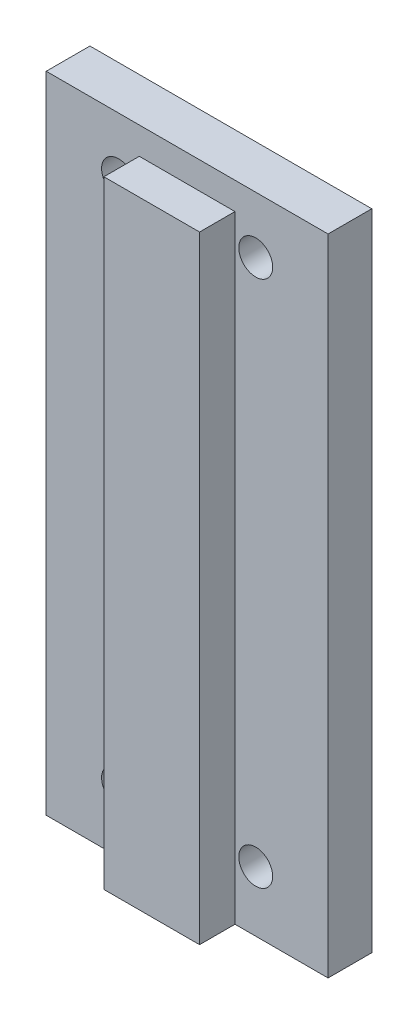
ISO-10303-21;
HEADER;
FILE_DESCRIPTION(('STEP AP214'),'2;1');
FILE_NAME('part.step','',(''),(''),'','','');
FILE_SCHEMA(('AUTOMOTIVE_DESIGN { 1 0 10303 214 1 1 1 1 }'));
ENDSEC;
DATA;
#1=APPLICATION_CONTEXT('core data for automotive mechanical design processes');
#2=APPLICATION_PROTOCOL_DEFINITION('international standard','automotive_design',2000,#1);
#3=PRODUCT_CONTEXT('',#1,'mechanical');
#4=PRODUCT('Part','Part','',(#3));
#5=PRODUCT_RELATED_PRODUCT_CATEGORY('part','',(#4));
#6=PRODUCT_DEFINITION_FORMATION('','',#4);
#7=PRODUCT_DEFINITION_CONTEXT('part definition',#1,'design');
#8=PRODUCT_DEFINITION('design','',#6,#7);
#9=PRODUCT_DEFINITION_SHAPE('','',#8);
#10=(LENGTH_UNIT() NAMED_UNIT(*) SI_UNIT(.MILLI.,.METRE.));
#11=(NAMED_UNIT(*) PLANE_ANGLE_UNIT() SI_UNIT($,.RADIAN.));
#12=(NAMED_UNIT(*) SI_UNIT($,.STERADIAN.) SOLID_ANGLE_UNIT());
#13=UNCERTAINTY_MEASURE_WITH_UNIT(LENGTH_MEASURE(1.E-05),#10,'distance_accuracy_value','');
#14=(GEOMETRIC_REPRESENTATION_CONTEXT(3) GLOBAL_UNCERTAINTY_ASSIGNED_CONTEXT((#13)) GLOBAL_UNIT_ASSIGNED_CONTEXT((#10,
#11,#12)) REPRESENTATION_CONTEXT('',''));
#15=CARTESIAN_POINT('',(0.,0.,0.));
#16=DIRECTION('',(0.,0.,1.));
#17=DIRECTION('',(1.,0.,0.));
#18=AXIS2_PLACEMENT_3D('',#15,#16,#17);
#19=CARTESIAN_POINT('',(0.,0.,5.79999999999997));
#20=DIRECTION('',(0.,0.,-1.));
#21=DIRECTION('',(-1.,0.,0.));
#22=AXIS2_PLACEMENT_3D('',#19,#20,#21);
#23=PLANE('',#22);
#24=CARTESIAN_POINT('',(27.8,7.99999999999998,5.79999999999997));
#25=DIRECTION('',(0.,0.,-1.));
#26=DIRECTION('',(-1.,0.,0.));
#27=AXIS2_PLACEMENT_3D('',#24,#25,#26);
#28=CIRCLE('',#27,2.25);
#29=CARTESIAN_POINT('',(25.55,8.00000000000001,5.79999999999997));
#30=VERTEX_POINT('',#29);
#31=EDGE_CURVE('E330',#30,#30,#28,.F.);
#32=ORIENTED_EDGE('',*,*,#31,.F.);
#33=EDGE_LOOP('',(#32));
#34=FACE_BOUND('',#33,.T.);
#35=CARTESIAN_POINT('',(9.6,8.00000000000001,5.79999999999997));
#36=DIRECTION('',(0.,0.,-1.));
#37=DIRECTION('',(-1.,0.,0.));
#38=AXIS2_PLACEMENT_3D('',#35,#36,#37);
#39=CIRCLE('',#38,2.25);
#40=CARTESIAN_POINT('',(7.35000000000001,8.00000000000001,5.79999999999997));
#41=VERTEX_POINT('',#40);
#42=EDGE_CURVE('E341',#41,#41,#39,.F.);
#43=ORIENTED_EDGE('',*,*,#42,.F.);
#44=EDGE_LOOP('',(#43));
#45=FACE_BOUND('',#44,.T.);
#46=CARTESIAN_POINT('',(9.59999999999998,78.,5.80000000000003));
#47=DIRECTION('',(0.,0.,-1.));
#48=DIRECTION('',(-1.,0.,0.));
#49=AXIS2_PLACEMENT_3D('',#46,#47,#48);
#50=CIRCLE('',#49,2.25);
#51=CARTESIAN_POINT('',(7.35,78.,5.80000000000003));
#52=VERTEX_POINT('',#51);
#53=EDGE_CURVE('E348',#52,#52,#50,.F.);
#54=ORIENTED_EDGE('',*,*,#53,.F.);
#55=EDGE_LOOP('',(#54));
#56=FACE_BOUND('',#55,.T.);
#57=CARTESIAN_POINT('',(27.8,78.,5.80000000000003));
#58=DIRECTION('',(0.,0.,-1.));
#59=DIRECTION('',(-1.,0.,0.));
#60=AXIS2_PLACEMENT_3D('',#57,#58,#59);
#61=CIRCLE('',#60,2.25);
#62=CARTESIAN_POINT('',(25.55,78.,5.80000000000003));
#63=VERTEX_POINT('',#62);
#64=EDGE_CURVE('E214',#63,#63,#61,.F.);
#65=ORIENTED_EDGE('',*,*,#64,.F.);
#66=EDGE_LOOP('',(#65));
#67=FACE_BOUND('',#66,.T.);
#68=DIRECTION('',(0.,-1.,0.));
#69=VECTOR('',#68,1.);
#70=CARTESIAN_POINT('',(12.35,0.,5.79999999999997));
#71=LINE('',#70,#69);
#72=CARTESIAN_POINT('',(12.35,81.9,5.8));
#73=VERTEX_POINT('',#72);
#74=CARTESIAN_POINT('',(12.35,0.,5.79999999999997));
#75=VERTEX_POINT('',#74);
#76=EDGE_CURVE('E54',#73,#75,#71,.T.);
#77=ORIENTED_EDGE('',*,*,#76,.F.);
#78=DIRECTION('',(-1.,0.,0.));
#79=VECTOR('',#78,1.);
#80=CARTESIAN_POINT('',(12.35,81.9,5.8));
#81=LINE('',#80,#79);
#82=CARTESIAN_POINT('',(25.05,81.9,5.8));
#83=VERTEX_POINT('',#82);
#84=EDGE_CURVE('E124',#83,#73,#81,.T.);
#85=ORIENTED_EDGE('',*,*,#84,.F.);
#86=DIRECTION('',(0.,1.,0.));
#87=VECTOR('',#86,1.);
#88=CARTESIAN_POINT('',(25.05,0.,5.79999999999997));
#89=LINE('',#88,#87);
#90=CARTESIAN_POINT('',(25.05,0.,5.79999999999997));
#91=VERTEX_POINT('',#90);
#92=EDGE_CURVE('E60',#91,#83,#89,.T.);
#93=ORIENTED_EDGE('',*,*,#92,.F.);
#94=DIRECTION('',(1.,0.,0.));
#95=VECTOR('',#94,1.);
#96=CARTESIAN_POINT('',(0.,0.,5.79999999999997));
#97=LINE('',#96,#95);
#98=CARTESIAN_POINT('',(37.4,0.,5.80000000000003));
#99=VERTEX_POINT('',#98);
#100=EDGE_CURVE('E144',#91,#99,#97,.T.);
#101=ORIENTED_EDGE('',*,*,#100,.T.);
#102=DIRECTION('',(0.,1.,0.));
#103=VECTOR('',#102,1.);
#104=CARTESIAN_POINT('',(37.4,0.,5.80000000000003));
#105=LINE('',#104,#103);
#106=CARTESIAN_POINT('',(37.4,85.5,5.8));
#107=VERTEX_POINT('',#106);
#108=EDGE_CURVE('E149',#99,#107,#105,.T.);
#109=ORIENTED_EDGE('',*,*,#108,.T.);
#110=DIRECTION('',(-1.,0.,0.));
#111=VECTOR('',#110,1.);
#112=CARTESIAN_POINT('',(0.,85.5,5.8));
#113=LINE('',#112,#111);
#114=CARTESIAN_POINT('',(0.,85.5,5.8));
#115=VERTEX_POINT('',#114);
#116=EDGE_CURVE('E152',#107,#115,#113,.T.);
#117=ORIENTED_EDGE('',*,*,#116,.T.);
#118=DIRECTION('',(0.,-1.,0.));
#119=VECTOR('',#118,1.);
#120=CARTESIAN_POINT('',(0.,0.,5.79999999999997));
#121=LINE('',#120,#119);
#122=CARTESIAN_POINT('',(0.,0.,5.79999999999997));
#123=VERTEX_POINT('',#122);
#124=EDGE_CURVE('E140',#115,#123,#121,.T.);
#125=ORIENTED_EDGE('',*,*,#124,.T.);
#126=EDGE_CURVE('E146',#123,#75,#97,.T.);
#127=ORIENTED_EDGE('',*,*,#126,.T.);
#128=EDGE_LOOP('',(#77,#85,#93,#101,#109,#117,#125,#127));
#129=FACE_BOUND('',#128,.T.);
#130=ADVANCED_FACE('F38',(#34,#45,#56,#67,#129),#23,.F.);
#131=CARTESIAN_POINT('',(0.,0.,5.79999999999997));
#132=DIRECTION('',(1.,0.,0.));
#133=DIRECTION('',(0.,0.,-1.));
#134=AXIS2_PLACEMENT_3D('',#131,#132,#133);
#135=PLANE('',#134);
#136=DIRECTION('',(0.,-1.,0.));
#137=VECTOR('',#136,1.);
#138=CARTESIAN_POINT('',(0.,0.,0.));
#139=LINE('',#138,#137);
#140=CARTESIAN_POINT('',(0.,85.5,0.));
#141=VERTEX_POINT('',#140);
#142=CARTESIAN_POINT('',(0.,0.,0.));
#143=VERTEX_POINT('',#142);
#144=EDGE_CURVE('E128',#141,#143,#139,.T.);
#145=ORIENTED_EDGE('',*,*,#144,.T.);
#146=DIRECTION('',(0.,0.,-1.));
#147=VECTOR('',#146,1.);
#148=CARTESIAN_POINT('',(0.,0.,5.79999999999997));
#149=LINE('',#148,#147);
#150=EDGE_CURVE('E11',#123,#143,#149,.T.);
#151=ORIENTED_EDGE('',*,*,#150,.F.);
#152=ORIENTED_EDGE('',*,*,#124,.F.);
#153=DIRECTION('',(0.,0.,-1.));
#154=VECTOR('',#153,1.);
#155=CARTESIAN_POINT('',(0.,85.5,5.8));
#156=LINE('',#155,#154);
#157=EDGE_CURVE('E154',#115,#141,#156,.T.);
#158=ORIENTED_EDGE('',*,*,#157,.T.);
#159=EDGE_LOOP('',(#145,#151,#152,#158));
#160=FACE_BOUND('',#159,.T.);
#161=ADVANCED_FACE('F40',(#160),#135,.F.);
#162=CARTESIAN_POINT('',(0.,0.,5.79999999999997));
#163=DIRECTION('',(0.,1.,0.));
#164=DIRECTION('',(0.,0.,1.));
#165=AXIS2_PLACEMENT_3D('',#162,#163,#164);
#166=PLANE('',#165);
#167=DIRECTION('',(1.,0.,0.));
#168=VECTOR('',#167,1.);
#169=CARTESIAN_POINT('',(0.,0.,0.));
#170=LINE('',#169,#168);
#171=CARTESIAN_POINT('',(37.4,0.,0.));
#172=VERTEX_POINT('',#171);
#173=EDGE_CURVE('E134',#143,#172,#170,.T.);
#174=ORIENTED_EDGE('',*,*,#173,.T.);
#175=DIRECTION('',(0.,0.,-1.));
#176=VECTOR('',#175,1.);
#177=CARTESIAN_POINT('',(37.4,0.,5.80000000000003));
#178=LINE('',#177,#176);
#179=EDGE_CURVE('E47',#99,#172,#178,.T.);
#180=ORIENTED_EDGE('',*,*,#179,.F.);
#181=ORIENTED_EDGE('',*,*,#100,.F.);
#182=DIRECTION('',(0.,0.,-1.));
#183=VECTOR('',#182,1.);
#184=CARTESIAN_POINT('',(25.05,0.,10.5));
#185=LINE('',#184,#183);
#186=CARTESIAN_POINT('',(25.05,0.,10.5));
#187=VERTEX_POINT('',#186);
#188=EDGE_CURVE('E109',#187,#91,#185,.T.);
#189=ORIENTED_EDGE('',*,*,#188,.F.);
#190=DIRECTION('',(1.,0.,0.));
#191=VECTOR('',#190,1.);
#192=CARTESIAN_POINT('',(12.35,0.,10.5));
#193=LINE('',#192,#191);
#194=CARTESIAN_POINT('',(12.35,0.,10.5));
#195=VERTEX_POINT('',#194);
#196=EDGE_CURVE('E103',#195,#187,#193,.T.);
#197=ORIENTED_EDGE('',*,*,#196,.F.);
#198=DIRECTION('',(0.,0.,-1.));
#199=VECTOR('',#198,1.);
#200=CARTESIAN_POINT('',(12.35,0.,10.5));
#201=LINE('',#200,#199);
#202=EDGE_CURVE('E107',#195,#75,#201,.T.);
#203=ORIENTED_EDGE('',*,*,#202,.T.);
#204=ORIENTED_EDGE('',*,*,#126,.F.);
#205=ORIENTED_EDGE('',*,*,#150,.T.);
#206=EDGE_LOOP('',(#174,#180,#181,#189,#197,#203,#204,#205));
#207=FACE_BOUND('',#206,.T.);
#208=ADVANCED_FACE('F105',(#207),#166,.F.);
#209=CARTESIAN_POINT('',(37.4,0.,5.80000000000003));
#210=DIRECTION('',(-1.,0.,0.));
#211=DIRECTION('',(0.,0.,1.));
#212=AXIS2_PLACEMENT_3D('',#209,#210,#211);
#213=PLANE('',#212);
#214=DIRECTION('',(0.,1.,0.));
#215=VECTOR('',#214,1.);
#216=CARTESIAN_POINT('',(37.4,0.,0.));
#217=LINE('',#216,#215);
#218=CARTESIAN_POINT('',(37.4,85.5,0.));
#219=VERTEX_POINT('',#218);
#220=EDGE_CURVE('E158',#172,#219,#217,.T.);
#221=ORIENTED_EDGE('',*,*,#220,.T.);
#222=DIRECTION('',(0.,0.,-1.));
#223=VECTOR('',#222,1.);
#224=CARTESIAN_POINT('',(37.4,85.5,5.8));
#225=LINE('',#224,#223);
#226=EDGE_CURVE('E166',#107,#219,#225,.T.);
#227=ORIENTED_EDGE('',*,*,#226,.F.);
#228=ORIENTED_EDGE('',*,*,#108,.F.);
#229=ORIENTED_EDGE('',*,*,#179,.T.);
#230=EDGE_LOOP('',(#221,#227,#228,#229));
#231=FACE_BOUND('',#230,.T.);
#232=ADVANCED_FACE('F176',(#231),#213,.F.);
#233=CARTESIAN_POINT('',(0.,85.5,5.8));
#234=DIRECTION('',(0.,-1.,0.));
#235=DIRECTION('',(0.,0.,-1.));
#236=AXIS2_PLACEMENT_3D('',#233,#234,#235);
#237=PLANE('',#236);
#238=DIRECTION('',(-1.,0.,0.));
#239=VECTOR('',#238,1.);
#240=CARTESIAN_POINT('',(0.,85.5,0.));
#241=LINE('',#240,#239);
#242=EDGE_CURVE('E145',#219,#141,#241,.T.);
#243=ORIENTED_EDGE('',*,*,#242,.T.);
#244=ORIENTED_EDGE('',*,*,#157,.F.);
#245=ORIENTED_EDGE('',*,*,#116,.F.);
#246=ORIENTED_EDGE('',*,*,#226,.T.);
#247=EDGE_LOOP('',(#243,#244,#245,#246));
#248=FACE_BOUND('',#247,.T.);
#249=ADVANCED_FACE('F184',(#248),#237,.F.);
#250=CARTESIAN_POINT('',(0.,0.,0.));
#251=DIRECTION('',(0.,0.,-1.));
#252=DIRECTION('',(-1.,0.,0.));
#253=AXIS2_PLACEMENT_3D('',#250,#251,#252);
#254=PLANE('',#253);
#255=CARTESIAN_POINT('',(27.8,8.00000000000001,0.));
#256=DIRECTION('',(0.,0.,-1.));
#257=DIRECTION('',(-1.,0.,0.));
#258=AXIS2_PLACEMENT_3D('',#255,#256,#257);
#259=CIRCLE('',#258,2.25);
#260=CARTESIAN_POINT('',(25.55,8.00000000000001,0.));
#261=VERTEX_POINT('',#260);
#262=EDGE_CURVE('E333',#261,#261,#259,.T.);
#263=ORIENTED_EDGE('',*,*,#262,.F.);
#264=EDGE_LOOP('',(#263));
#265=FACE_BOUND('',#264,.T.);
#266=CARTESIAN_POINT('',(9.6,8.00000000000001,0.));
#267=DIRECTION('',(0.,0.,-1.));
#268=DIRECTION('',(-1.,0.,0.));
#269=AXIS2_PLACEMENT_3D('',#266,#267,#268);
#270=CIRCLE('',#269,2.25);
#271=CARTESIAN_POINT('',(7.35000000000001,8.00000000000001,0.));
#272=VERTEX_POINT('',#271);
#273=EDGE_CURVE('E338',#272,#272,#270,.T.);
#274=ORIENTED_EDGE('',*,*,#273,.F.);
#275=EDGE_LOOP('',(#274));
#276=FACE_BOUND('',#275,.T.);
#277=CARTESIAN_POINT('',(9.59999999999998,78.,0.));
#278=DIRECTION('',(0.,0.,-1.));
#279=DIRECTION('',(-1.,0.,0.));
#280=AXIS2_PLACEMENT_3D('',#277,#278,#279);
#281=CIRCLE('',#280,2.25);
#282=CARTESIAN_POINT('',(7.35,78.,0.));
#283=VERTEX_POINT('',#282);
#284=EDGE_CURVE('E363',#283,#283,#281,.T.);
#285=ORIENTED_EDGE('',*,*,#284,.F.);
#286=EDGE_LOOP('',(#285));
#287=FACE_BOUND('',#286,.T.);
#288=CARTESIAN_POINT('',(27.8,78.,0.));
#289=DIRECTION('',(0.,0.,-1.));
#290=DIRECTION('',(-1.,0.,0.));
#291=AXIS2_PLACEMENT_3D('',#288,#289,#290);
#292=CIRCLE('',#291,2.25);
#293=CARTESIAN_POINT('',(25.55,78.,0.));
#294=VERTEX_POINT('',#293);
#295=EDGE_CURVE('E344',#294,#294,#292,.T.);
#296=ORIENTED_EDGE('',*,*,#295,.F.);
#297=EDGE_LOOP('',(#296));
#298=FACE_BOUND('',#297,.T.);
#299=ORIENTED_EDGE('',*,*,#144,.F.);
#300=ORIENTED_EDGE('',*,*,#242,.F.);
#301=ORIENTED_EDGE('',*,*,#220,.F.);
#302=ORIENTED_EDGE('',*,*,#173,.F.);
#303=EDGE_LOOP('',(#299,#300,#301,#302));
#304=FACE_BOUND('',#303,.T.);
#305=ADVANCED_FACE('F181',(#265,#276,#287,#298,#304),#254,.T.);
#306=CARTESIAN_POINT('',(12.35,0.,10.5));
#307=DIRECTION('',(1.,0.,0.));
#308=DIRECTION('',(0.,0.,-1.));
#309=AXIS2_PLACEMENT_3D('',#306,#307,#308);
#310=PLANE('',#309);
#311=ORIENTED_EDGE('',*,*,#76,.T.);
#312=ORIENTED_EDGE('',*,*,#202,.F.);
#313=DIRECTION('',(0.,-1.,0.));
#314=VECTOR('',#313,1.);
#315=CARTESIAN_POINT('',(12.35,0.,10.5));
#316=LINE('',#315,#314);
#317=CARTESIAN_POINT('',(12.35,81.9,10.5));
#318=VERTEX_POINT('',#317);
#319=EDGE_CURVE('E114',#318,#195,#316,.T.);
#320=ORIENTED_EDGE('',*,*,#319,.F.);
#321=DIRECTION('',(0.,0.,-1.));
#322=VECTOR('',#321,1.);
#323=CARTESIAN_POINT('',(12.35,81.9,10.5));
#324=LINE('',#323,#322);
#325=EDGE_CURVE('E209',#318,#73,#324,.T.);
#326=ORIENTED_EDGE('',*,*,#325,.T.);
#327=EDGE_LOOP('',(#311,#312,#320,#326));
#328=FACE_BOUND('',#327,.T.);
#329=ADVANCED_FACE('F126',(#328),#310,.F.);
#330=CARTESIAN_POINT('',(25.05,0.,10.5));
#331=DIRECTION('',(-1.,0.,0.));
#332=DIRECTION('',(0.,0.,1.));
#333=AXIS2_PLACEMENT_3D('',#330,#331,#332);
#334=PLANE('',#333);
#335=ORIENTED_EDGE('',*,*,#92,.T.);
#336=DIRECTION('',(0.,0.,-1.));
#337=VECTOR('',#336,1.);
#338=CARTESIAN_POINT('',(25.05,81.9,10.5));
#339=LINE('',#338,#337);
#340=CARTESIAN_POINT('',(25.05,81.9,10.5));
#341=VERTEX_POINT('',#340);
#342=EDGE_CURVE('E136',#341,#83,#339,.T.);
#343=ORIENTED_EDGE('',*,*,#342,.F.);
#344=DIRECTION('',(0.,1.,0.));
#345=VECTOR('',#344,1.);
#346=CARTESIAN_POINT('',(25.05,0.,10.5));
#347=LINE('',#346,#345);
#348=EDGE_CURVE('E113',#187,#341,#347,.T.);
#349=ORIENTED_EDGE('',*,*,#348,.F.);
#350=ORIENTED_EDGE('',*,*,#188,.T.);
#351=EDGE_LOOP('',(#335,#343,#349,#350));
#352=FACE_BOUND('',#351,.T.);
#353=ADVANCED_FACE('F202',(#352),#334,.F.);
#354=CARTESIAN_POINT('',(12.35,81.9,10.5));
#355=DIRECTION('',(0.,-1.,0.));
#356=DIRECTION('',(0.,0.,-1.));
#357=AXIS2_PLACEMENT_3D('',#354,#355,#356);
#358=PLANE('',#357);
#359=ORIENTED_EDGE('',*,*,#84,.T.);
#360=ORIENTED_EDGE('',*,*,#325,.F.);
#361=DIRECTION('',(-1.,0.,0.));
#362=VECTOR('',#361,1.);
#363=CARTESIAN_POINT('',(12.35,81.9,10.5));
#364=LINE('',#363,#362);
#365=EDGE_CURVE('E119',#341,#318,#364,.T.);
#366=ORIENTED_EDGE('',*,*,#365,.F.);
#367=ORIENTED_EDGE('',*,*,#342,.T.);
#368=EDGE_LOOP('',(#359,#360,#366,#367));
#369=FACE_BOUND('',#368,.T.);
#370=ADVANCED_FACE('F223',(#369),#358,.F.);
#371=CARTESIAN_POINT('',(0.,0.,10.5));
#372=DIRECTION('',(0.,0.,-1.));
#373=DIRECTION('',(-1.,0.,0.));
#374=AXIS2_PLACEMENT_3D('',#371,#372,#373);
#375=PLANE('',#374);
#376=ORIENTED_EDGE('',*,*,#319,.T.);
#377=ORIENTED_EDGE('',*,*,#196,.T.);
#378=ORIENTED_EDGE('',*,*,#348,.T.);
#379=ORIENTED_EDGE('',*,*,#365,.T.);
#380=EDGE_LOOP('',(#376,#377,#378,#379));
#381=FACE_BOUND('',#380,.T.);
#382=ADVANCED_FACE('F117',(#381),#375,.F.);
#383=CARTESIAN_POINT('',(27.8,78.,12.163961030679));
#384=DIRECTION('',(0.,0.,-1.));
#385=DIRECTION('',(-1.,0.,0.));
#386=AXIS2_PLACEMENT_3D('',#383,#384,#385);
#387=CYLINDRICAL_SURFACE('',#386,2.25);
#388=CARTESIAN_POINT('',(25.55,78.,5.80000000000003));
#389=CARTESIAN_POINT('',(25.55,78.,5.73958333333336));
#390=CARTESIAN_POINT('',(25.55,78.,5.67916666666669));
#391=CARTESIAN_POINT('',(25.55,78.,5.55833333333336));
#392=CARTESIAN_POINT('',(25.55,78.,5.49791666666669));
#393=CARTESIAN_POINT('',(25.55,78.,5.37708333333336));
#394=CARTESIAN_POINT('',(25.55,78.,5.31666666666669));
#395=CARTESIAN_POINT('',(25.55,78.,5.19583333333336));
#396=CARTESIAN_POINT('',(25.55,78.,5.13541666666669));
#397=CARTESIAN_POINT('',(25.55,78.,5.01458333333336));
#398=CARTESIAN_POINT('',(25.55,78.,4.95416666666669));
#399=CARTESIAN_POINT('',(25.55,78.,4.83333333333336));
#400=CARTESIAN_POINT('',(25.55,78.,4.77291666666669));
#401=CARTESIAN_POINT('',(25.55,78.,4.65208333333336));
#402=CARTESIAN_POINT('',(25.55,78.,4.59166666666669));
#403=CARTESIAN_POINT('',(25.55,78.,4.47083333333336));
#404=CARTESIAN_POINT('',(25.55,78.,4.41041666666669));
#405=CARTESIAN_POINT('',(25.55,78.,4.28958333333336));
#406=CARTESIAN_POINT('',(25.55,78.,4.22916666666669));
#407=CARTESIAN_POINT('',(25.55,78.,4.10833333333335));
#408=CARTESIAN_POINT('',(25.55,78.,4.04791666666669));
#409=CARTESIAN_POINT('',(25.55,78.,3.92708333333335));
#410=CARTESIAN_POINT('',(25.55,78.,3.86666666666669));
#411=CARTESIAN_POINT('',(25.55,78.,3.74583333333335));
#412=CARTESIAN_POINT('',(25.55,78.,3.68541666666668));
#413=CARTESIAN_POINT('',(25.55,78.,3.56458333333335));
#414=CARTESIAN_POINT('',(25.55,78.,3.50416666666668));
#415=CARTESIAN_POINT('',(25.55,78.,3.38333333333335));
#416=CARTESIAN_POINT('',(25.55,78.,3.32291666666668));
#417=CARTESIAN_POINT('',(25.55,78.,3.20208333333335));
#418=CARTESIAN_POINT('',(25.55,78.,3.14166666666668));
#419=CARTESIAN_POINT('',(25.55,78.,3.02083333333335));
#420=CARTESIAN_POINT('',(25.55,78.,2.96041666666668));
#421=CARTESIAN_POINT('',(25.55,78.,2.83958333333335));
#422=CARTESIAN_POINT('',(25.55,78.,2.77916666666668));
#423=CARTESIAN_POINT('',(25.55,78.,2.65833333333335));
#424=CARTESIAN_POINT('',(25.55,78.,2.59791666666668));
#425=CARTESIAN_POINT('',(25.55,78.,2.47708333333334));
#426=CARTESIAN_POINT('',(25.55,78.,2.41666666666668));
#427=CARTESIAN_POINT('',(25.55,78.,2.29583333333334));
#428=CARTESIAN_POINT('',(25.55,78.,2.23541666666668));
#429=CARTESIAN_POINT('',(25.55,78.,2.11458333333334));
#430=CARTESIAN_POINT('',(25.55,78.,2.05416666666668));
#431=CARTESIAN_POINT('',(25.55,78.,1.93333333333334));
#432=CARTESIAN_POINT('',(25.55,78.,1.87291666666668));
#433=CARTESIAN_POINT('',(25.55,78.,1.75208333333334));
#434=CARTESIAN_POINT('',(25.55,78.,1.69166666666667));
#435=CARTESIAN_POINT('',(25.55,78.,1.57083333333334));
#436=CARTESIAN_POINT('',(25.55,78.,1.51041666666667));
#437=CARTESIAN_POINT('',(25.55,78.,1.38958333333334));
#438=CARTESIAN_POINT('',(25.55,78.,1.32916666666667));
#439=CARTESIAN_POINT('',(25.55,78.,1.20833333333334));
#440=CARTESIAN_POINT('',(25.55,78.,1.14791666666667));
#441=CARTESIAN_POINT('',(25.55,78.,1.02708333333334));
#442=CARTESIAN_POINT('',(25.55,78.,0.966666666666671));
#443=CARTESIAN_POINT('',(25.55,78.,0.845833333333337));
#444=CARTESIAN_POINT('',(25.55,78.,0.78541666666667));
#445=CARTESIAN_POINT('',(25.55,78.,0.664583333333336));
#446=CARTESIAN_POINT('',(25.55,78.,0.60416666666667));
#447=CARTESIAN_POINT('',(25.55,78.,0.483333333333336));
#448=CARTESIAN_POINT('',(25.55,78.,0.422916666666669));
#449=CARTESIAN_POINT('',(25.55,78.,0.302083333333335));
#450=CARTESIAN_POINT('',(25.55,78.,0.241666666666668));
#451=CARTESIAN_POINT('',(25.55,78.,0.120833333333334));
#452=CARTESIAN_POINT('',(25.55,78.,0.060416666666667));
#453=CARTESIAN_POINT('',(25.55,78.,0.));
#454=B_SPLINE_CURVE_WITH_KNOTS('',3,(#388,#389,#390,#391,#392,#393,#394,#395,#396,#397,#398,
#399,#400,#401,#402,#403,#404,#405,#406,#407,#408,#409,#410,#411,#412,#413,#414,#415,#416,#417,
#418,#419,#420,#421,#422,#423,#424,#425,#426,#427,#428,#429,#430,#431,#432,#433,#434,#435,#436,
#437,#438,#439,#440,#441,#442,#443,#444,#445,#446,#447,#448,#449,#450,#451,#452,#453),
.UNSPECIFIED.,.F.,.F.,(4,2,2,2,2,2,2,2,2,2,2,2,2,2,2,2,2,2,2,2,2,2,2,2,2,2,2,2,2,2,2,2,4),(0.,
0.18125,0.362500000000001,0.543750000000002,0.725000000000003,0.906250000000003,1.0875,
1.26875000000001,1.45000000000001,1.63125000000001,1.81250000000001,1.99375000000001,
2.17500000000001,2.35625000000001,2.53750000000001,2.71875000000001,2.90000000000001,
3.08125000000001,3.26250000000002,3.44375000000002,3.62500000000002,3.80625000000002,
3.98750000000002,4.16875000000002,4.35000000000002,4.53125000000002,4.71250000000002,
4.89375000000002,5.07500000000002,5.25625000000002,5.43750000000003,5.61875000000003,
5.80000000000003),.UNSPECIFIED.);
#455=EDGE_CURVE('BSEAM230',#63,#294,#454,.T.);
#456=ORIENTED_EDGE('',*,*,#64,.T.);
#457=ORIENTED_EDGE('',*,*,#295,.T.);
#458=ORIENTED_EDGE('',*,*,#455,.T.);
#459=ORIENTED_EDGE('',*,*,#455,.F.);
#460=EDGE_LOOP('',(#456,#458,#457,#459));
#461=FACE_BOUND('',#460,.T.);
#462=ADVANCED_FACE('F230',(#461),#387,.F.);
#463=CARTESIAN_POINT('',(9.6,78.,12.163961030679));
#464=DIRECTION('',(0.,0.,-1.));
#465=DIRECTION('',(-1.,0.,0.));
#466=AXIS2_PLACEMENT_3D('',#463,#464,#465);
#467=CYLINDRICAL_SURFACE('',#466,2.25);
#468=CARTESIAN_POINT('',(7.35,78.,5.80000000000003));
#469=CARTESIAN_POINT('',(7.35,78.,5.73958333333336));
#470=CARTESIAN_POINT('',(7.35,78.,5.67916666666669));
#471=CARTESIAN_POINT('',(7.35,78.,5.55833333333336));
#472=CARTESIAN_POINT('',(7.35,78.,5.49791666666669));
#473=CARTESIAN_POINT('',(7.35,78.,5.37708333333336));
#474=CARTESIAN_POINT('',(7.35,78.,5.31666666666669));
#475=CARTESIAN_POINT('',(7.35,78.,5.19583333333336));
#476=CARTESIAN_POINT('',(7.35,78.,5.13541666666669));
#477=CARTESIAN_POINT('',(7.35,78.,5.01458333333336));
#478=CARTESIAN_POINT('',(7.35,78.,4.95416666666669));
#479=CARTESIAN_POINT('',(7.35,78.,4.83333333333336));
#480=CARTESIAN_POINT('',(7.35,78.,4.77291666666669));
#481=CARTESIAN_POINT('',(7.35,78.,4.65208333333336));
#482=CARTESIAN_POINT('',(7.35,78.,4.59166666666669));
#483=CARTESIAN_POINT('',(7.35,78.,4.47083333333336));
#484=CARTESIAN_POINT('',(7.35,78.,4.41041666666669));
#485=CARTESIAN_POINT('',(7.35,78.,4.28958333333336));
#486=CARTESIAN_POINT('',(7.35,78.,4.22916666666669));
#487=CARTESIAN_POINT('',(7.35,78.,4.10833333333335));
#488=CARTESIAN_POINT('',(7.35,78.,4.04791666666669));
#489=CARTESIAN_POINT('',(7.35,78.,3.92708333333335));
#490=CARTESIAN_POINT('',(7.35,78.,3.86666666666669));
#491=CARTESIAN_POINT('',(7.35,78.,3.74583333333335));
#492=CARTESIAN_POINT('',(7.35,78.,3.68541666666668));
#493=CARTESIAN_POINT('',(7.35,78.,3.56458333333335));
#494=CARTESIAN_POINT('',(7.35,78.,3.50416666666668));
#495=CARTESIAN_POINT('',(7.35,78.,3.38333333333335));
#496=CARTESIAN_POINT('',(7.35,78.,3.32291666666668));
#497=CARTESIAN_POINT('',(7.35,78.,3.20208333333335));
#498=CARTESIAN_POINT('',(7.35,78.,3.14166666666668));
#499=CARTESIAN_POINT('',(7.35,78.,3.02083333333335));
#500=CARTESIAN_POINT('',(7.35,78.,2.96041666666668));
#501=CARTESIAN_POINT('',(7.35,78.,2.83958333333335));
#502=CARTESIAN_POINT('',(7.35,78.,2.77916666666668));
#503=CARTESIAN_POINT('',(7.35,78.,2.65833333333335));
#504=CARTESIAN_POINT('',(7.35,78.,2.59791666666668));
#505=CARTESIAN_POINT('',(7.35,78.,2.47708333333334));
#506=CARTESIAN_POINT('',(7.35,78.,2.41666666666668));
#507=CARTESIAN_POINT('',(7.35,78.,2.29583333333334));
#508=CARTESIAN_POINT('',(7.35,78.,2.23541666666668));
#509=CARTESIAN_POINT('',(7.35,78.,2.11458333333334));
#510=CARTESIAN_POINT('',(7.35,78.,2.05416666666668));
#511=CARTESIAN_POINT('',(7.35,78.,1.93333333333334));
#512=CARTESIAN_POINT('',(7.35,78.,1.87291666666668));
#513=CARTESIAN_POINT('',(7.35,78.,1.75208333333334));
#514=CARTESIAN_POINT('',(7.35,78.,1.69166666666667));
#515=CARTESIAN_POINT('',(7.35,78.,1.57083333333334));
#516=CARTESIAN_POINT('',(7.35,78.,1.51041666666667));
#517=CARTESIAN_POINT('',(7.35,78.,1.38958333333334));
#518=CARTESIAN_POINT('',(7.35,78.,1.32916666666667));
#519=CARTESIAN_POINT('',(7.35,78.,1.20833333333334));
#520=CARTESIAN_POINT('',(7.35,78.,1.14791666666667));
#521=CARTESIAN_POINT('',(7.35,78.,1.02708333333334));
#522=CARTESIAN_POINT('',(7.35,78.,0.966666666666671));
#523=CARTESIAN_POINT('',(7.35,78.,0.845833333333337));
#524=CARTESIAN_POINT('',(7.35,78.,0.78541666666667));
#525=CARTESIAN_POINT('',(7.35,78.,0.664583333333336));
#526=CARTESIAN_POINT('',(7.35,78.,0.60416666666667));
#527=CARTESIAN_POINT('',(7.35,78.,0.483333333333336));
#528=CARTESIAN_POINT('',(7.35,78.,0.422916666666669));
#529=CARTESIAN_POINT('',(7.35,78.,0.302083333333335));
#530=CARTESIAN_POINT('',(7.35,78.,0.241666666666668));
#531=CARTESIAN_POINT('',(7.35,78.,0.120833333333334));
#532=CARTESIAN_POINT('',(7.35,78.,0.060416666666667));
#533=CARTESIAN_POINT('',(7.35,78.,0.));
#534=B_SPLINE_CURVE_WITH_KNOTS('',3,(#468,#469,#470,#471,#472,#473,#474,#475,#476,#477,#478,
#479,#480,#481,#482,#483,#484,#485,#486,#487,#488,#489,#490,#491,#492,#493,#494,#495,#496,#497,
#498,#499,#500,#501,#502,#503,#504,#505,#506,#507,#508,#509,#510,#511,#512,#513,#514,#515,#516,
#517,#518,#519,#520,#521,#522,#523,#524,#525,#526,#527,#528,#529,#530,#531,#532,#533),
.UNSPECIFIED.,.F.,.F.,(4,2,2,2,2,2,2,2,2,2,2,2,2,2,2,2,2,2,2,2,2,2,2,2,2,2,2,2,2,2,2,2,4),(0.,
0.18125,0.362500000000001,0.543750000000002,0.725000000000003,0.906250000000003,1.0875,
1.26875000000001,1.45000000000001,1.63125000000001,1.81250000000001,1.99375000000001,
2.17500000000001,2.35625000000001,2.53750000000001,2.71875000000001,2.90000000000001,
3.08125000000001,3.26250000000002,3.44375000000002,3.62500000000002,3.80625000000002,
3.98750000000002,4.16875000000002,4.35000000000002,4.53125000000002,4.71250000000002,
4.89375000000002,5.07500000000002,5.25625000000002,5.43750000000003,5.61875000000003,
5.80000000000003),.UNSPECIFIED.);
#535=EDGE_CURVE('BSEAM294',#52,#283,#534,.T.);
#536=ORIENTED_EDGE('',*,*,#53,.T.);
#537=ORIENTED_EDGE('',*,*,#284,.T.);
#538=ORIENTED_EDGE('',*,*,#535,.T.);
#539=ORIENTED_EDGE('',*,*,#535,.F.);
#540=EDGE_LOOP('',(#536,#538,#537,#539));
#541=FACE_BOUND('',#540,.T.);
#542=ADVANCED_FACE('F294',(#541),#467,.F.);
#543=CARTESIAN_POINT('',(9.60000000000001,8.00000000000001,12.163961030679));
#544=DIRECTION('',(0.,0.,-1.));
#545=DIRECTION('',(-1.,0.,0.));
#546=AXIS2_PLACEMENT_3D('',#543,#544,#545);
#547=CYLINDRICAL_SURFACE('',#546,2.25);
#548=CARTESIAN_POINT('',(7.35000000000001,8.00000000000001,5.79999999999997));
#549=CARTESIAN_POINT('',(7.35000000000001,8.00000000000001,5.73958333333331));
#550=CARTESIAN_POINT('',(7.35000000000001,8.00000000000001,5.67916666666664));
#551=CARTESIAN_POINT('',(7.35000000000001,8.00000000000001,5.55833333333331));
#552=CARTESIAN_POINT('',(7.35000000000001,8.00000000000001,5.49791666666664));
#553=CARTESIAN_POINT('',(7.35000000000001,8.00000000000001,5.37708333333331));
#554=CARTESIAN_POINT('',(7.35000000000001,8.00000000000001,5.31666666666665));
#555=CARTESIAN_POINT('',(7.35000000000001,8.00000000000001,5.19583333333331));
#556=CARTESIAN_POINT('',(7.35000000000001,8.00000000000001,5.13541666666665));
#557=CARTESIAN_POINT('',(7.35000000000001,8.00000000000001,5.01458333333332));
#558=CARTESIAN_POINT('',(7.35000000000001,8.00000000000001,4.95416666666665));
#559=CARTESIAN_POINT('',(7.35000000000001,8.00000000000001,4.83333333333332));
#560=CARTESIAN_POINT('',(7.35000000000001,8.00000000000001,4.77291666666665));
#561=CARTESIAN_POINT('',(7.35000000000001,8.00000000000001,4.65208333333332));
#562=CARTESIAN_POINT('',(7.35000000000001,8.00000000000001,4.59166666666666));
#563=CARTESIAN_POINT('',(7.35000000000001,8.00000000000001,4.47083333333333));
#564=CARTESIAN_POINT('',(7.35000000000001,8.00000000000001,4.41041666666666));
#565=CARTESIAN_POINT('',(7.35000000000001,8.00000000000001,4.28958333333333));
#566=CARTESIAN_POINT('',(7.35000000000001,8.00000000000001,4.22916666666666));
#567=CARTESIAN_POINT('',(7.35000000000001,8.00000000000001,4.10833333333333));
#568=CARTESIAN_POINT('',(7.35000000000001,8.00000000000001,4.04791666666667));
#569=CARTESIAN_POINT('',(7.35000000000001,8.00000000000001,3.92708333333333));
#570=CARTESIAN_POINT('',(7.35000000000001,8.00000000000001,3.86666666666667));
#571=CARTESIAN_POINT('',(7.35000000000001,8.00000000000001,3.74583333333334));
#572=CARTESIAN_POINT('',(7.35000000000001,8.00000000000001,3.68541666666667));
#573=CARTESIAN_POINT('',(7.35000000000001,8.00000000000001,3.56458333333334));
#574=CARTESIAN_POINT('',(7.35000000000001,8.00000000000001,3.50416666666667));
#575=CARTESIAN_POINT('',(7.35000000000001,8.00000000000001,3.38333333333334));
#576=CARTESIAN_POINT('',(7.35000000000001,8.00000000000001,3.32291666666667));
#577=CARTESIAN_POINT('',(7.35000000000001,8.00000000000001,3.20208333333334));
#578=CARTESIAN_POINT('',(7.35000000000001,8.00000000000001,3.14166666666668));
#579=CARTESIAN_POINT('',(7.35000000000001,8.00000000000001,3.02083333333335));
#580=CARTESIAN_POINT('',(7.35000000000001,8.00000000000001,2.96041666666668));
#581=CARTESIAN_POINT('',(7.35000000000001,8.00000000000001,2.83958333333335));
#582=CARTESIAN_POINT('',(7.35000000000001,8.00000000000001,2.77916666666668));
#583=CARTESIAN_POINT('',(7.35000000000001,8.00000000000001,2.65833333333335));
#584=CARTESIAN_POINT('',(7.35000000000001,8.00000000000001,2.59791666666668));
#585=CARTESIAN_POINT('',(7.35000000000001,8.00000000000001,2.47708333333335));
#586=CARTESIAN_POINT('',(7.35000000000001,8.00000000000001,2.41666666666669));
#587=CARTESIAN_POINT('',(7.35000000000001,8.00000000000001,2.29583333333336));
#588=CARTESIAN_POINT('',(7.35000000000001,8.00000000000001,2.23541666666669));
#589=CARTESIAN_POINT('',(7.35000000000001,8.00000000000001,2.11458333333336));
#590=CARTESIAN_POINT('',(7.35000000000001,8.00000000000001,2.05416666666669));
#591=CARTESIAN_POINT('',(7.35000000000001,8.00000000000001,1.93333333333336));
#592=CARTESIAN_POINT('',(7.35000000000001,8.00000000000001,1.8729166666667));
#593=CARTESIAN_POINT('',(7.35000000000001,8.00000000000001,1.75208333333336));
#594=CARTESIAN_POINT('',(7.35000000000001,8.00000000000001,1.6916666666667));
#595=CARTESIAN_POINT('',(7.35000000000001,8.00000000000001,1.57083333333337));
#596=CARTESIAN_POINT('',(7.35000000000001,8.00000000000001,1.5104166666667));
#597=CARTESIAN_POINT('',(7.35000000000001,8.00000000000001,1.38958333333337));
#598=CARTESIAN_POINT('',(7.35000000000001,8.00000000000001,1.3291666666667));
#599=CARTESIAN_POINT('',(7.35000000000001,8.00000000000001,1.20833333333337));
#600=CARTESIAN_POINT('',(7.35000000000001,8.00000000000001,1.14791666666671));
#601=CARTESIAN_POINT('',(7.35000000000001,8.00000000000001,1.02708333333337));
#602=CARTESIAN_POINT('',(7.35000000000001,8.00000000000001,0.966666666666708));
#603=CARTESIAN_POINT('',(7.35000000000001,8.00000000000001,0.845833333333377));
#604=CARTESIAN_POINT('',(7.35000000000001,8.00000000000001,0.785416666666711));
#605=CARTESIAN_POINT('',(7.35000000000001,8.00000000000001,0.664583333333379));
#606=CARTESIAN_POINT('',(7.35000000000001,8.00000000000001,0.604166666666713));
#607=CARTESIAN_POINT('',(7.35000000000001,8.00000000000001,0.483333333333382));
#608=CARTESIAN_POINT('',(7.35000000000001,8.00000000000001,0.422916666666716));
#609=CARTESIAN_POINT('',(7.35000000000001,8.00000000000001,0.302083333333384));
#610=CARTESIAN_POINT('',(7.35000000000001,8.00000000000001,0.241666666666719));
#611=CARTESIAN_POINT('',(7.35000000000001,8.00000000000001,0.120833333333387));
#612=CARTESIAN_POINT('',(7.35000000000001,8.00000000000001,0.0604166666667213));
#613=CARTESIAN_POINT('',(7.35000000000001,8.00000000000001,0.));
#614=B_SPLINE_CURVE_WITH_KNOTS('',3,(#548,#549,#550,#551,#552,#553,#554,#555,#556,#557,#558,
#559,#560,#561,#562,#563,#564,#565,#566,#567,#568,#569,#570,#571,#572,#573,#574,#575,#576,#577,
#578,#579,#580,#581,#582,#583,#584,#585,#586,#587,#588,#589,#590,#591,#592,#593,#594,#595,#596,
#597,#598,#599,#600,#601,#602,#603,#604,#605,#606,#607,#608,#609,#610,#611,#612,#613),
.UNSPECIFIED.,.F.,.F.,(4,2,2,2,2,2,2,2,2,2,2,2,2,2,2,2,2,2,2,2,2,2,2,2,2,2,2,2,2,2,2,2,4),(0.,
0.181249999999997,0.362499999999994,0.543749999999991,0.724999999999989,0.906249999999986,
1.08749999999998,1.26874999999998,1.44999999999998,1.63124999999997,1.81249999999997,
1.99374999999997,2.17499999999997,2.35624999999997,2.53749999999996,2.71874999999996,
2.89999999999996,3.08124999999996,3.26249999999995,3.44374999999995,3.62499999999995,
3.80624999999995,3.98749999999994,4.16874999999994,4.34999999999994,4.53124999999993,
4.71249999999993,4.89374999999993,5.07499999999993,5.25624999999992,5.43749999999992,
5.61874999999992,5.79999999999992),.UNSPECIFIED.);
#615=EDGE_CURVE('BSEAM304',#41,#272,#614,.T.);
#616=ORIENTED_EDGE('',*,*,#42,.T.);
#617=ORIENTED_EDGE('',*,*,#273,.T.);
#618=ORIENTED_EDGE('',*,*,#615,.T.);
#619=ORIENTED_EDGE('',*,*,#615,.F.);
#620=EDGE_LOOP('',(#616,#618,#617,#619));
#621=FACE_BOUND('',#620,.T.);
#622=ADVANCED_FACE('F304',(#621),#547,.F.);
#623=CARTESIAN_POINT('',(27.8,8.00000000000001,12.163961030679));
#624=DIRECTION('',(0.,0.,-1.));
#625=DIRECTION('',(-1.,0.,0.));
#626=AXIS2_PLACEMENT_3D('',#623,#624,#625);
#627=CYLINDRICAL_SURFACE('',#626,2.25);
#628=CARTESIAN_POINT('',(25.55,8.00000000000001,5.79999999999997));
#629=CARTESIAN_POINT('',(25.55,8.00000000000001,5.73958333333331));
#630=CARTESIAN_POINT('',(25.55,8.00000000000001,5.67916666666664));
#631=CARTESIAN_POINT('',(25.55,8.00000000000001,5.55833333333331));
#632=CARTESIAN_POINT('',(25.55,8.00000000000001,5.49791666666664));
#633=CARTESIAN_POINT('',(25.55,8.00000000000001,5.37708333333331));
#634=CARTESIAN_POINT('',(25.55,8.00000000000001,5.31666666666665));
#635=CARTESIAN_POINT('',(25.55,8.00000000000001,5.19583333333331));
#636=CARTESIAN_POINT('',(25.55,8.00000000000001,5.13541666666665));
#637=CARTESIAN_POINT('',(25.55,8.00000000000001,5.01458333333332));
#638=CARTESIAN_POINT('',(25.55,8.00000000000001,4.95416666666665));
#639=CARTESIAN_POINT('',(25.55,8.00000000000001,4.83333333333332));
#640=CARTESIAN_POINT('',(25.55,8.00000000000001,4.77291666666665));
#641=CARTESIAN_POINT('',(25.55,8.00000000000001,4.65208333333332));
#642=CARTESIAN_POINT('',(25.55,8.00000000000001,4.59166666666666));
#643=CARTESIAN_POINT('',(25.55,8.00000000000001,4.47083333333333));
#644=CARTESIAN_POINT('',(25.55,8.00000000000001,4.41041666666666));
#645=CARTESIAN_POINT('',(25.55,8.00000000000001,4.28958333333333));
#646=CARTESIAN_POINT('',(25.55,8.00000000000001,4.22916666666666));
#647=CARTESIAN_POINT('',(25.55,8.00000000000001,4.10833333333333));
#648=CARTESIAN_POINT('',(25.55,8.00000000000001,4.04791666666667));
#649=CARTESIAN_POINT('',(25.55,8.00000000000001,3.92708333333333));
#650=CARTESIAN_POINT('',(25.55,8.00000000000001,3.86666666666667));
#651=CARTESIAN_POINT('',(25.55,8.00000000000001,3.74583333333334));
#652=CARTESIAN_POINT('',(25.55,8.00000000000001,3.68541666666667));
#653=CARTESIAN_POINT('',(25.55,8.00000000000001,3.56458333333334));
#654=CARTESIAN_POINT('',(25.55,8.00000000000001,3.50416666666667));
#655=CARTESIAN_POINT('',(25.55,8.00000000000001,3.38333333333334));
#656=CARTESIAN_POINT('',(25.55,8.00000000000001,3.32291666666667));
#657=CARTESIAN_POINT('',(25.55,8.00000000000001,3.20208333333334));
#658=CARTESIAN_POINT('',(25.55,8.00000000000001,3.14166666666668));
#659=CARTESIAN_POINT('',(25.55,8.00000000000001,3.02083333333335));
#660=CARTESIAN_POINT('',(25.55,8.00000000000001,2.96041666666668));
#661=CARTESIAN_POINT('',(25.55,8.00000000000001,2.83958333333335));
#662=CARTESIAN_POINT('',(25.55,8.00000000000001,2.77916666666668));
#663=CARTESIAN_POINT('',(25.55,8.00000000000001,2.65833333333335));
#664=CARTESIAN_POINT('',(25.55,8.00000000000001,2.59791666666668));
#665=CARTESIAN_POINT('',(25.55,8.00000000000001,2.47708333333335));
#666=CARTESIAN_POINT('',(25.55,8.00000000000001,2.41666666666669));
#667=CARTESIAN_POINT('',(25.55,8.00000000000001,2.29583333333336));
#668=CARTESIAN_POINT('',(25.55,8.00000000000001,2.23541666666669));
#669=CARTESIAN_POINT('',(25.55,8.00000000000001,2.11458333333336));
#670=CARTESIAN_POINT('',(25.55,8.00000000000001,2.05416666666669));
#671=CARTESIAN_POINT('',(25.55,8.00000000000001,1.93333333333336));
#672=CARTESIAN_POINT('',(25.55,8.00000000000001,1.8729166666667));
#673=CARTESIAN_POINT('',(25.55,8.00000000000001,1.75208333333336));
#674=CARTESIAN_POINT('',(25.55,8.00000000000001,1.6916666666667));
#675=CARTESIAN_POINT('',(25.55,8.00000000000001,1.57083333333337));
#676=CARTESIAN_POINT('',(25.55,8.00000000000001,1.5104166666667));
#677=CARTESIAN_POINT('',(25.55,8.00000000000001,1.38958333333337));
#678=CARTESIAN_POINT('',(25.55,8.00000000000001,1.3291666666667));
#679=CARTESIAN_POINT('',(25.55,8.00000000000001,1.20833333333337));
#680=CARTESIAN_POINT('',(25.55,8.00000000000001,1.14791666666671));
#681=CARTESIAN_POINT('',(25.55,8.00000000000001,1.02708333333337));
#682=CARTESIAN_POINT('',(25.55,8.00000000000001,0.966666666666708));
#683=CARTESIAN_POINT('',(25.55,8.00000000000001,0.845833333333377));
#684=CARTESIAN_POINT('',(25.55,8.00000000000001,0.785416666666711));
#685=CARTESIAN_POINT('',(25.55,8.00000000000001,0.664583333333379));
#686=CARTESIAN_POINT('',(25.55,8.00000000000001,0.604166666666713));
#687=CARTESIAN_POINT('',(25.55,8.00000000000001,0.483333333333382));
#688=CARTESIAN_POINT('',(25.55,8.00000000000001,0.422916666666716));
#689=CARTESIAN_POINT('',(25.55,8.00000000000001,0.302083333333384));
#690=CARTESIAN_POINT('',(25.55,8.00000000000001,0.241666666666719));
#691=CARTESIAN_POINT('',(25.55,8.00000000000001,0.120833333333387));
#692=CARTESIAN_POINT('',(25.55,8.00000000000001,0.0604166666667213));
#693=CARTESIAN_POINT('',(25.55,8.00000000000001,0.));
#694=B_SPLINE_CURVE_WITH_KNOTS('',3,(#628,#629,#630,#631,#632,#633,#634,#635,#636,#637,#638,
#639,#640,#641,#642,#643,#644,#645,#646,#647,#648,#649,#650,#651,#652,#653,#654,#655,#656,#657,
#658,#659,#660,#661,#662,#663,#664,#665,#666,#667,#668,#669,#670,#671,#672,#673,#674,#675,#676,
#677,#678,#679,#680,#681,#682,#683,#684,#685,#686,#687,#688,#689,#690,#691,#692,#693),
.UNSPECIFIED.,.F.,.F.,(4,2,2,2,2,2,2,2,2,2,2,2,2,2,2,2,2,2,2,2,2,2,2,2,2,2,2,2,2,2,2,2,4),(0.,
0.181249999999997,0.362499999999994,0.543749999999991,0.724999999999989,0.906249999999986,
1.08749999999998,1.26874999999998,1.44999999999998,1.63124999999997,1.81249999999997,
1.99374999999997,2.17499999999997,2.35624999999997,2.53749999999996,2.71874999999996,
2.89999999999996,3.08124999999996,3.26249999999995,3.44374999999995,3.62499999999995,
3.80624999999995,3.98749999999994,4.16874999999994,4.34999999999994,4.53124999999993,
4.71249999999993,4.89374999999993,5.07499999999993,5.25624999999992,5.43749999999992,
5.61874999999992,5.79999999999992),.UNSPECIFIED.);
#695=EDGE_CURVE('BSEAM314',#30,#261,#694,.T.);
#696=ORIENTED_EDGE('',*,*,#31,.T.);
#697=ORIENTED_EDGE('',*,*,#262,.T.);
#698=ORIENTED_EDGE('',*,*,#695,.T.);
#699=ORIENTED_EDGE('',*,*,#695,.F.);
#700=EDGE_LOOP('',(#696,#698,#697,#699));
#701=FACE_BOUND('',#700,.T.);
#702=ADVANCED_FACE('F314',(#701),#627,.F.);
#703=CLOSED_SHELL('',(#130,#161,#208,#232,#249,#305,#329,#353,#370,#382,#462,#542,#622,#702));
#704=MANIFOLD_SOLID_BREP('B2',#703);
#705=ADVANCED_BREP_SHAPE_REPRESENTATION('',(#18,#704),#14);
#706=SHAPE_DEFINITION_REPRESENTATION(#9,#705);
ENDSEC;
END-ISO-10303-21;
